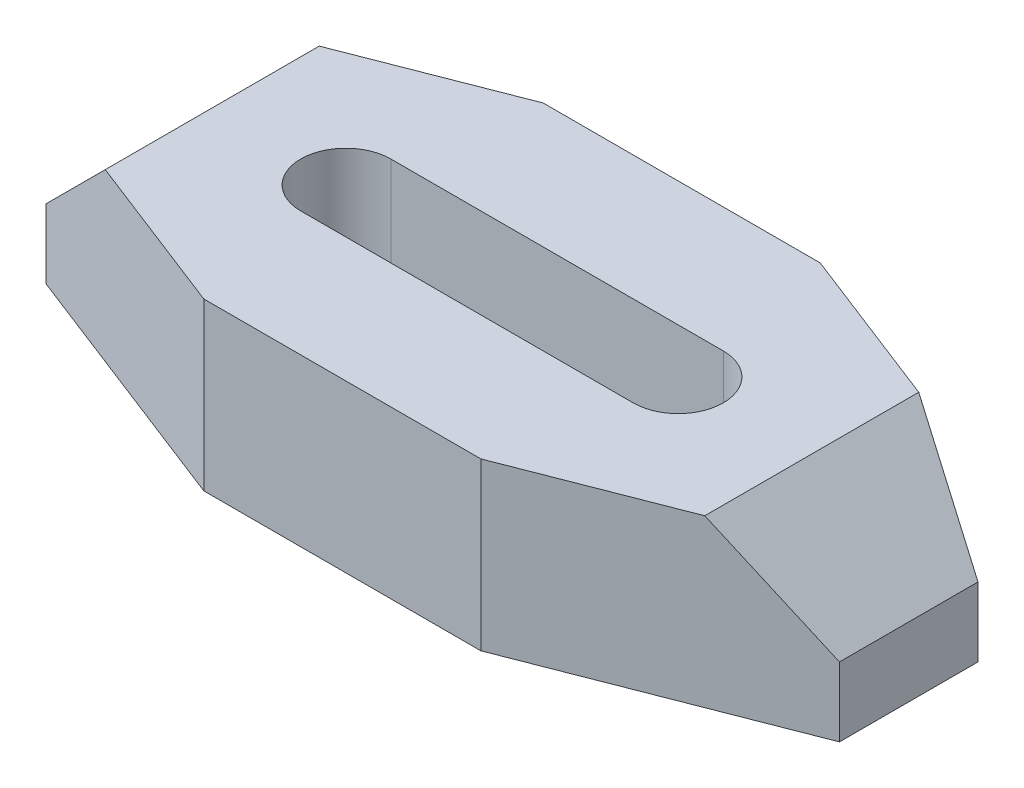
ISO-10303-21;
HEADER;
FILE_DESCRIPTION(('STEP AP214'),'2;1');
FILE_NAME('part.step','',(''),(''),'','','');
FILE_SCHEMA(('AUTOMOTIVE_DESIGN { 1 0 10303 214 1 1 1 1 }'));
ENDSEC;
DATA;
#1=APPLICATION_CONTEXT('core data for automotive mechanical design processes');
#2=APPLICATION_PROTOCOL_DEFINITION('international standard','automotive_design',2000,#1);
#3=PRODUCT_CONTEXT('',#1,'mechanical');
#4=PRODUCT('Part','Part','',(#3));
#5=PRODUCT_RELATED_PRODUCT_CATEGORY('part','',(#4));
#6=PRODUCT_DEFINITION_FORMATION('','',#4);
#7=PRODUCT_DEFINITION_CONTEXT('part definition',#1,'design');
#8=PRODUCT_DEFINITION('design','',#6,#7);
#9=PRODUCT_DEFINITION_SHAPE('','',#8);
#10=(LENGTH_UNIT() NAMED_UNIT(*) SI_UNIT(.MILLI.,.METRE.));
#11=(NAMED_UNIT(*) PLANE_ANGLE_UNIT() SI_UNIT($,.RADIAN.));
#12=(NAMED_UNIT(*) SI_UNIT($,.STERADIAN.) SOLID_ANGLE_UNIT());
#13=UNCERTAINTY_MEASURE_WITH_UNIT(LENGTH_MEASURE(1.E-05),#10,'distance_accuracy_value','');
#14=(GEOMETRIC_REPRESENTATION_CONTEXT(3) GLOBAL_UNCERTAINTY_ASSIGNED_CONTEXT((#13)) GLOBAL_UNIT_ASSIGNED_CONTEXT((#10,
#11,#12)) REPRESENTATION_CONTEXT('',''));
#15=CARTESIAN_POINT('',(0.,0.,0.));
#16=DIRECTION('',(0.,0.,1.));
#17=DIRECTION('',(1.,0.,0.));
#18=AXIS2_PLACEMENT_3D('',#15,#16,#17);
#19=CARTESIAN_POINT('',(0.,2.4,0.));
#20=DIRECTION('',(0.,1.,0.));
#21=DIRECTION('',(0.,0.,1.));
#22=AXIS2_PLACEMENT_3D('',#19,#20,#21);
#23=PLANE('',#22);
#24=DIRECTION('',(0.931983771317935,0.,-0.3625));
#25=VECTOR('',#24,1.);
#26=CARTESIAN_POINT('',(-0.604426001316983,2.4,1.58234276939121));
#27=LINE('',#26,#25);
#28=CARTESIAN_POINT('',(-0.604426001316983,2.4,1.58234276939121));
#29=VERTEX_POINT('',#28);
#30=CARTESIAN_POINT('',(1.72350908395476,2.4,0.676880148279621));
#31=VERTEX_POINT('',#30);
#32=EDGE_CURVE('E185',#29,#31,#27,.T.);
#33=ORIENTED_EDGE('',*,*,#32,.T.);
#34=DIRECTION('',(0.,0.,-1.));
#35=VECTOR('',#34,1.);
#36=CARTESIAN_POINT('',(1.72350908395475,2.4,-1.86765723060879));
#37=LINE('',#36,#35);
#38=CARTESIAN_POINT('',(1.72350908395476,2.4,-2.41219460949719));
#39=VERTEX_POINT('',#38);
#40=EDGE_CURVE('E239',#31,#39,#37,.T.);
#41=ORIENTED_EDGE('',*,*,#40,.T.);
#42=DIRECTION('',(-0.931983771317935,0.,-0.3625));
#43=VECTOR('',#42,1.);
#44=CARTESIAN_POINT('',(-0.604426001316983,2.4,-3.31765723060879));
#45=LINE('',#44,#43);
#46=CARTESIAN_POINT('',(-0.604426001316983,2.4,-3.31765723060879));
#47=VERTEX_POINT('',#46);
#48=EDGE_CURVE('E188',#39,#47,#45,.T.);
#49=ORIENTED_EDGE('',*,*,#48,.T.);
#50=DIRECTION('',(-1.,0.,0.));
#51=VECTOR('',#50,1.);
#52=CARTESIAN_POINT('',(-0.604426001316983,2.4,-3.31765723060879));
#53=LINE('',#52,#51);
#54=CARTESIAN_POINT('',(-4.60442600131698,2.4,-3.31765723060879));
#55=VERTEX_POINT('',#54);
#56=EDGE_CURVE('E190',#47,#55,#53,.T.);
#57=ORIENTED_EDGE('',*,*,#56,.T.);
#58=DIRECTION('',(-0.931983771317935,0.,0.3625));
#59=VECTOR('',#58,1.);
#60=CARTESIAN_POINT('',(-4.60442600131698,2.4,-3.31765723060879));
#61=LINE('',#60,#59);
#62=CARTESIAN_POINT('',(-6.93236108658872,2.4,-2.41219460949719));
#63=VERTEX_POINT('',#62);
#64=EDGE_CURVE('E177',#55,#63,#61,.T.);
#65=ORIENTED_EDGE('',*,*,#64,.T.);
#66=DIRECTION('',(0.,0.,1.));
#67=VECTOR('',#66,1.);
#68=CARTESIAN_POINT('',(-6.93236108658872,2.4,0.132342769391215));
#69=LINE('',#68,#67);
#70=CARTESIAN_POINT('',(-6.93236108658872,2.4,0.67688014827962));
#71=VERTEX_POINT('',#70);
#72=EDGE_CURVE('E230',#63,#71,#69,.T.);
#73=ORIENTED_EDGE('',*,*,#72,.T.);
#74=DIRECTION('',(0.931983771317935,0.,0.3625));
#75=VECTOR('',#74,1.);
#76=CARTESIAN_POINT('',(-4.60442600131698,2.4,1.58234276939121));
#77=LINE('',#76,#75);
#78=CARTESIAN_POINT('',(-4.60442600131698,2.4,1.58234276939121));
#79=VERTEX_POINT('',#78);
#80=EDGE_CURVE('E180',#71,#79,#77,.T.);
#81=ORIENTED_EDGE('',*,*,#80,.T.);
#82=DIRECTION('',(1.,0.,0.));
#83=VECTOR('',#82,1.);
#84=CARTESIAN_POINT('',(-0.604426001316983,2.4,1.58234276939121));
#85=LINE('',#84,#83);
#86=EDGE_CURVE('E183',#79,#29,#85,.T.);
#87=ORIENTED_EDGE('',*,*,#86,.T.);
#88=EDGE_LOOP('',(#33,#41,#49,#57,#65,#73,#81,#87));
#89=FACE_BOUND('',#88,.T.);
#90=DIRECTION('',(1.,0.,0.));
#91=VECTOR('',#90,1.);
#92=CARTESIAN_POINT('',(-0.204426001316984,2.4,-0.217657230608786));
#93=LINE('',#92,#91);
#94=CARTESIAN_POINT('',(-5.00442600131698,2.4,-0.217657230608786));
#95=VERTEX_POINT('',#94);
#96=CARTESIAN_POINT('',(-0.204426001316984,2.4,-0.217657230608786));
#97=VERTEX_POINT('',#96);
#98=EDGE_CURVE('E146',#95,#97,#93,.T.);
#99=ORIENTED_EDGE('',*,*,#98,.F.);
#100=CARTESIAN_POINT('',(-5.00442600131698,2.4,-0.867657230608785));
#101=DIRECTION('',(0.,1.,0.));
#102=DIRECTION('',(0.,0.,-1.));
#103=AXIS2_PLACEMENT_3D('',#100,#101,#102);
#104=CIRCLE('',#103,0.65);
#105=CARTESIAN_POINT('',(-5.00442600131698,2.4,-1.51765723060879));
#106=VERTEX_POINT('',#105);
#107=EDGE_CURVE('E136',#106,#95,#104,.T.);
#108=ORIENTED_EDGE('',*,*,#107,.F.);
#109=DIRECTION('',(-1.,0.,0.));
#110=VECTOR('',#109,1.);
#111=CARTESIAN_POINT('',(-0.204426001316984,2.4,-1.51765723060879));
#112=LINE('',#111,#110);
#113=CARTESIAN_POINT('',(-0.204426001316984,2.4,-1.51765723060879));
#114=VERTEX_POINT('',#113);
#115=EDGE_CURVE('E161',#114,#106,#112,.T.);
#116=ORIENTED_EDGE('',*,*,#115,.F.);
#117=CARTESIAN_POINT('',(-0.204426001316984,2.4,-0.867657230608785));
#118=DIRECTION('',(0.,1.,0.));
#119=DIRECTION('',(0.,0.,1.));
#120=AXIS2_PLACEMENT_3D('',#117,#118,#119);
#121=CIRCLE('',#120,0.65);
#122=EDGE_CURVE('E159',#97,#114,#121,.T.);
#123=ORIENTED_EDGE('',*,*,#122,.F.);
#124=EDGE_LOOP('',(#99,#108,#116,#123));
#125=FACE_BOUND('',#124,.T.);
#126=ADVANCED_FACE('F35',(#89,#125),#23,.T.);
#127=CARTESIAN_POINT('',(0.,0.,0.));
#128=DIRECTION('',(0.,1.,0.));
#129=DIRECTION('',(0.,0.,1.));
#130=AXIS2_PLACEMENT_3D('',#127,#128,#129);
#131=PLANE('',#130);
#132=DIRECTION('',(-0.931983771317935,0.,0.3625));
#133=VECTOR('',#132,1.);
#134=CARTESIAN_POINT('',(-4.60442600131698,0.,-3.31765723060879));
#135=LINE('',#134,#133);
#136=CARTESIAN_POINT('',(-4.60442600131698,0.,-3.31765723060879));
#137=VERTEX_POINT('',#136);
#138=CARTESIAN_POINT('',(-8.33236108658872,0.,-1.86765723060879));
#139=VERTEX_POINT('',#138);
#140=EDGE_CURVE('E154',#137,#139,#135,.T.);
#141=ORIENTED_EDGE('',*,*,#140,.F.);
#142=DIRECTION('',(-1.,0.,0.));
#143=VECTOR('',#142,1.);
#144=CARTESIAN_POINT('',(-0.604426001316983,0.,-3.31765723060879));
#145=LINE('',#144,#143);
#146=CARTESIAN_POINT('',(-0.604426001316983,0.,-3.31765723060879));
#147=VERTEX_POINT('',#146);
#148=EDGE_CURVE('E181',#147,#137,#145,.T.);
#149=ORIENTED_EDGE('',*,*,#148,.F.);
#150=DIRECTION('',(-0.931983771317935,0.,-0.3625));
#151=VECTOR('',#150,1.);
#152=CARTESIAN_POINT('',(-0.604426001316983,0.,-3.31765723060879));
#153=LINE('',#152,#151);
#154=CARTESIAN_POINT('',(3.12350908395475,0.,-1.86765723060879));
#155=VERTEX_POINT('',#154);
#156=EDGE_CURVE('E208',#155,#147,#153,.T.);
#157=ORIENTED_EDGE('',*,*,#156,.F.);
#158=DIRECTION('',(0.,0.,-1.));
#159=VECTOR('',#158,1.);
#160=CARTESIAN_POINT('',(3.12350908395475,0.,-1.86765723060879));
#161=LINE('',#160,#159);
#162=CARTESIAN_POINT('',(3.12350908395475,0.,0.132342769391215));
#163=VERTEX_POINT('',#162);
#164=EDGE_CURVE('E205',#163,#155,#161,.T.);
#165=ORIENTED_EDGE('',*,*,#164,.F.);
#166=DIRECTION('',(0.931983771317935,0.,-0.3625));
#167=VECTOR('',#166,1.);
#168=CARTESIAN_POINT('',(-0.604426001316983,0.,1.58234276939121));
#169=LINE('',#168,#167);
#170=CARTESIAN_POINT('',(-0.604426001316983,0.,1.58234276939121));
#171=VERTEX_POINT('',#170);
#172=EDGE_CURVE('E202',#171,#163,#169,.T.);
#173=ORIENTED_EDGE('',*,*,#172,.F.);
#174=DIRECTION('',(1.,0.,0.));
#175=VECTOR('',#174,1.);
#176=CARTESIAN_POINT('',(-0.604426001316983,0.,1.58234276939121));
#177=LINE('',#176,#175);
#178=CARTESIAN_POINT('',(-4.60442600131698,0.,1.58234276939121));
#179=VERTEX_POINT('',#178);
#180=EDGE_CURVE('E200',#179,#171,#177,.T.);
#181=ORIENTED_EDGE('',*,*,#180,.F.);
#182=DIRECTION('',(0.931983771317935,0.,0.3625));
#183=VECTOR('',#182,1.);
#184=CARTESIAN_POINT('',(-4.60442600131698,0.,1.58234276939121));
#185=LINE('',#184,#183);
#186=CARTESIAN_POINT('',(-8.33236108658872,0.,0.132342769391215));
#187=VERTEX_POINT('',#186);
#188=EDGE_CURVE('E198',#187,#179,#185,.T.);
#189=ORIENTED_EDGE('',*,*,#188,.F.);
#190=DIRECTION('',(0.,0.,1.));
#191=VECTOR('',#190,1.);
#192=CARTESIAN_POINT('',(-8.33236108658872,0.,-1.86765723060879));
#193=LINE('',#192,#191);
#194=EDGE_CURVE('E195',#139,#187,#193,.T.);
#195=ORIENTED_EDGE('',*,*,#194,.F.);
#196=EDGE_LOOP('',(#141,#149,#157,#165,#173,#181,#189,#195));
#197=FACE_BOUND('',#196,.T.);
#198=CARTESIAN_POINT('',(-5.00442600131698,0.,-0.867657230608785));
#199=DIRECTION('',(0.,1.,0.));
#200=DIRECTION('',(0.,0.,-1.));
#201=AXIS2_PLACEMENT_3D('',#198,#199,#200);
#202=CIRCLE('',#201,0.65);
#203=CARTESIAN_POINT('',(-5.00442600131698,0.,-1.51765723060879));
#204=VERTEX_POINT('',#203);
#205=CARTESIAN_POINT('',(-5.00442600131698,0.,-0.217657230608786));
#206=VERTEX_POINT('',#205);
#207=EDGE_CURVE('E165',#204,#206,#202,.T.);
#208=ORIENTED_EDGE('',*,*,#207,.T.);
#209=DIRECTION('',(1.,0.,0.));
#210=VECTOR('',#209,1.);
#211=CARTESIAN_POINT('',(-0.204426001316984,0.,-0.217657230608786));
#212=LINE('',#211,#210);
#213=CARTESIAN_POINT('',(-0.204426001316984,0.,-0.217657230608786));
#214=VERTEX_POINT('',#213);
#215=EDGE_CURVE('E153',#206,#214,#212,.T.);
#216=ORIENTED_EDGE('',*,*,#215,.T.);
#217=CARTESIAN_POINT('',(-0.204426001316984,0.,-0.867657230608785));
#218=DIRECTION('',(0.,1.,0.));
#219=DIRECTION('',(0.,0.,1.));
#220=AXIS2_PLACEMENT_3D('',#217,#218,#219);
#221=CIRCLE('',#220,0.65);
#222=CARTESIAN_POINT('',(-0.204426001316984,0.,-1.51765723060879));
#223=VERTEX_POINT('',#222);
#224=EDGE_CURVE('E168',#214,#223,#221,.T.);
#225=ORIENTED_EDGE('',*,*,#224,.T.);
#226=DIRECTION('',(-1.,0.,0.));
#227=VECTOR('',#226,1.);
#228=CARTESIAN_POINT('',(-0.204426001316984,0.,-1.51765723060879));
#229=LINE('',#228,#227);
#230=EDGE_CURVE('E147',#223,#204,#229,.T.);
#231=ORIENTED_EDGE('',*,*,#230,.T.);
#232=EDGE_LOOP('',(#208,#216,#225,#231));
#233=FACE_BOUND('',#232,.T.);
#234=ADVANCED_FACE('F275',(#197,#233),#131,.F.);
#235=CARTESIAN_POINT('',(-4.60442600131698,2.4,-3.31765723060879));
#236=DIRECTION('',(0.3625,0.,0.931983771317934));
#237=DIRECTION('',(0.931983771317935,0.,-0.3625));
#238=AXIS2_PLACEMENT_3D('',#235,#236,#237);
#239=PLANE('',#238);
#240=DIRECTION('',(0.,-1.,0.));
#241=VECTOR('',#240,1.);
#242=CARTESIAN_POINT('',(-8.33236108658872,2.4,-1.86765723060879));
#243=LINE('',#242,#241);
#244=CARTESIAN_POINT('',(-8.33236108658872,0.999999999999996,-1.86765723060879));
#245=VERTEX_POINT('',#244);
#246=EDGE_CURVE('E228',#245,#139,#243,.T.);
#247=ORIENTED_EDGE('',*,*,#246,.F.);
#248=DIRECTION('',(0.681790434938534,0.681790434938536,-0.265185983137583));
#249=VECTOR('',#248,1.);
#250=CARTESIAN_POINT('',(-7.36848892771288,1.96387215887584,-2.24256038702147));
#251=LINE('',#250,#249);
#252=EDGE_CURVE('E237',#245,#63,#251,.T.);
#253=ORIENTED_EDGE('',*,*,#252,.T.);
#254=ORIENTED_EDGE('',*,*,#64,.F.);
#255=DIRECTION('',(0.,-1.,0.));
#256=VECTOR('',#255,1.);
#257=CARTESIAN_POINT('',(-4.60442600131698,2.4,-3.31765723060879));
#258=LINE('',#257,#256);
#259=EDGE_CURVE('E192',#55,#137,#258,.T.);
#260=ORIENTED_EDGE('',*,*,#259,.T.);
#261=ORIENTED_EDGE('',*,*,#140,.T.);
#262=EDGE_LOOP('',(#247,#253,#254,#260,#261));
#263=FACE_BOUND('',#262,.T.);
#264=ADVANCED_FACE('F294',(#263),#239,.F.);
#265=CARTESIAN_POINT('',(-8.33236108658872,2.4,-1.86765723060879));
#266=DIRECTION('',(1.,0.,0.));
#267=DIRECTION('',(0.,0.,-1.));
#268=AXIS2_PLACEMENT_3D('',#265,#266,#267);
#269=PLANE('',#268);
#270=DIRECTION('',(0.,-1.,0.));
#271=VECTOR('',#270,1.);
#272=CARTESIAN_POINT('',(-8.33236108658872,2.4,0.132342769391215));
#273=LINE('',#272,#271);
#274=CARTESIAN_POINT('',(-8.33236108658872,0.999999999999996,0.132342769391215));
#275=VERTEX_POINT('',#274);
#276=EDGE_CURVE('E226',#275,#187,#273,.T.);
#277=ORIENTED_EDGE('',*,*,#276,.F.);
#278=DIRECTION('',(0.,0.,-1.));
#279=VECTOR('',#278,1.);
#280=CARTESIAN_POINT('',(-8.33236108658872,0.999999999999996,-1.86765723060879));
#281=LINE('',#280,#279);
#282=EDGE_CURVE('E235',#275,#245,#281,.T.);
#283=ORIENTED_EDGE('',*,*,#282,.T.);
#284=ORIENTED_EDGE('',*,*,#246,.T.);
#285=ORIENTED_EDGE('',*,*,#194,.T.);
#286=EDGE_LOOP('',(#277,#283,#284,#285));
#287=FACE_BOUND('',#286,.T.);
#288=ADVANCED_FACE('F268',(#287),#269,.F.);
#289=CARTESIAN_POINT('',(-4.60442600131698,2.4,1.58234276939121));
#290=DIRECTION('',(0.3625,0.,-0.931983771317934));
#291=DIRECTION('',(-0.931983771317935,0.,-0.3625));
#292=AXIS2_PLACEMENT_3D('',#289,#290,#291);
#293=PLANE('',#292);
#294=ORIENTED_EDGE('',*,*,#80,.F.);
#295=DIRECTION('',(-0.681790434938534,-0.681790434938536,-0.265185983137583));
#296=VECTOR('',#295,1.);
#297=CARTESIAN_POINT('',(-7.05474187485793,2.2776192117308,0.6292794956579));
#298=LINE('',#297,#296);
#299=EDGE_CURVE('E233',#71,#275,#298,.T.);
#300=ORIENTED_EDGE('',*,*,#299,.T.);
#301=ORIENTED_EDGE('',*,*,#276,.T.);
#302=ORIENTED_EDGE('',*,*,#188,.T.);
#303=DIRECTION('',(0.,-1.,0.));
#304=VECTOR('',#303,1.);
#305=CARTESIAN_POINT('',(-4.60442600131698,2.4,1.58234276939121));
#306=LINE('',#305,#304);
#307=EDGE_CURVE('E223',#79,#179,#306,.T.);
#308=ORIENTED_EDGE('',*,*,#307,.F.);
#309=EDGE_LOOP('',(#294,#300,#301,#302,#308));
#310=FACE_BOUND('',#309,.T.);
#311=ADVANCED_FACE('F265',(#310),#293,.F.);
#312=CARTESIAN_POINT('',(-0.604426001316983,2.4,1.58234276939121));
#313=DIRECTION('',(0.,0.,-1.));
#314=DIRECTION('',(-1.,0.,0.));
#315=AXIS2_PLACEMENT_3D('',#312,#313,#314);
#316=PLANE('',#315);
#317=ORIENTED_EDGE('',*,*,#180,.T.);
#318=DIRECTION('',(0.,-1.,0.));
#319=VECTOR('',#318,1.);
#320=CARTESIAN_POINT('',(-0.604426001316983,2.4,1.58234276939121));
#321=LINE('',#320,#319);
#322=EDGE_CURVE('E220',#29,#171,#321,.T.);
#323=ORIENTED_EDGE('',*,*,#322,.F.);
#324=ORIENTED_EDGE('',*,*,#86,.F.);
#325=ORIENTED_EDGE('',*,*,#307,.T.);
#326=EDGE_LOOP('',(#317,#323,#324,#325));
#327=FACE_BOUND('',#326,.T.);
#328=ADVANCED_FACE('F280',(#327),#316,.F.);
#329=CARTESIAN_POINT('',(-0.604426001316983,2.4,1.58234276939121));
#330=DIRECTION('',(-0.3625,0.,-0.931983771317934));
#331=DIRECTION('',(-0.931983771317935,0.,0.3625));
#332=AXIS2_PLACEMENT_3D('',#329,#330,#331);
#333=PLANE('',#332);
#334=DIRECTION('',(0.,-1.,0.));
#335=VECTOR('',#334,1.);
#336=CARTESIAN_POINT('',(3.12350908395475,2.4,0.132342769391215));
#337=LINE('',#336,#335);
#338=CARTESIAN_POINT('',(3.12350908395475,0.999999999999994,0.132342769391215));
#339=VERTEX_POINT('',#338);
#340=EDGE_CURVE('E218',#339,#163,#337,.T.);
#341=ORIENTED_EDGE('',*,*,#340,.F.);
#342=DIRECTION('',(-0.681790434938534,0.681790434938536,0.265185983137583));
#343=VECTOR('',#342,1.);
#344=CARTESIAN_POINT('',(1.84588987222396,2.2776192117308,0.6292794956579));
#345=LINE('',#344,#343);
#346=EDGE_CURVE('E11',#339,#31,#345,.T.);
#347=ORIENTED_EDGE('',*,*,#346,.T.);
#348=ORIENTED_EDGE('',*,*,#32,.F.);
#349=ORIENTED_EDGE('',*,*,#322,.T.);
#350=ORIENTED_EDGE('',*,*,#172,.T.);
#351=EDGE_LOOP('',(#341,#347,#348,#349,#350));
#352=FACE_BOUND('',#351,.T.);
#353=ADVANCED_FACE('F283',(#352),#333,.F.);
#354=CARTESIAN_POINT('',(3.12350908395475,2.4,-1.86765723060879));
#355=DIRECTION('',(-1.,0.,0.));
#356=DIRECTION('',(0.,0.,1.));
#357=AXIS2_PLACEMENT_3D('',#354,#355,#356);
#358=PLANE('',#357);
#359=DIRECTION('',(0.,-1.,0.));
#360=VECTOR('',#359,1.);
#361=CARTESIAN_POINT('',(3.12350908395475,2.4,-1.86765723060879));
#362=LINE('',#361,#360);
#363=CARTESIAN_POINT('',(3.12350908395475,0.999999999999994,-1.86765723060879));
#364=VERTEX_POINT('',#363);
#365=EDGE_CURVE('E216',#364,#155,#362,.T.);
#366=ORIENTED_EDGE('',*,*,#365,.F.);
#367=DIRECTION('',(0.,0.,1.));
#368=VECTOR('',#367,1.);
#369=CARTESIAN_POINT('',(3.12350908395475,0.999999999999994,0.132342769391215));
#370=LINE('',#369,#368);
#371=EDGE_CURVE('E44',#364,#339,#370,.T.);
#372=ORIENTED_EDGE('',*,*,#371,.T.);
#373=ORIENTED_EDGE('',*,*,#340,.T.);
#374=ORIENTED_EDGE('',*,*,#164,.T.);
#375=EDGE_LOOP('',(#366,#372,#373,#374));
#376=FACE_BOUND('',#375,.T.);
#377=ADVANCED_FACE('F303',(#376),#358,.F.);
#378=CARTESIAN_POINT('',(-0.604426001316983,2.4,-3.31765723060879));
#379=DIRECTION('',(-0.3625,0.,0.931983771317934));
#380=DIRECTION('',(0.931983771317935,0.,0.3625));
#381=AXIS2_PLACEMENT_3D('',#378,#379,#380);
#382=PLANE('',#381);
#383=ORIENTED_EDGE('',*,*,#48,.F.);
#384=DIRECTION('',(0.681790434938534,-0.681790434938536,0.265185983137583));
#385=VECTOR('',#384,1.);
#386=CARTESIAN_POINT('',(2.15963692507891,1.96387215887584,-2.24256038702147));
#387=LINE('',#386,#385);
#388=EDGE_CURVE('E58',#39,#364,#387,.T.);
#389=ORIENTED_EDGE('',*,*,#388,.T.);
#390=ORIENTED_EDGE('',*,*,#365,.T.);
#391=ORIENTED_EDGE('',*,*,#156,.T.);
#392=DIRECTION('',(0.,-1.,0.));
#393=VECTOR('',#392,1.);
#394=CARTESIAN_POINT('',(-0.604426001316983,2.4,-3.31765723060879));
#395=LINE('',#394,#393);
#396=EDGE_CURVE('E213',#47,#147,#395,.T.);
#397=ORIENTED_EDGE('',*,*,#396,.F.);
#398=EDGE_LOOP('',(#383,#389,#390,#391,#397));
#399=FACE_BOUND('',#398,.T.);
#400=ADVANCED_FACE('F248',(#399),#382,.F.);
#401=CARTESIAN_POINT('',(-0.604426001316983,2.4,-3.31765723060879));
#402=DIRECTION('',(0.,0.,1.));
#403=DIRECTION('',(1.,0.,0.));
#404=AXIS2_PLACEMENT_3D('',#401,#402,#403);
#405=PLANE('',#404);
#406=ORIENTED_EDGE('',*,*,#148,.T.);
#407=ORIENTED_EDGE('',*,*,#259,.F.);
#408=ORIENTED_EDGE('',*,*,#56,.F.);
#409=ORIENTED_EDGE('',*,*,#396,.T.);
#410=EDGE_LOOP('',(#406,#407,#408,#409));
#411=FACE_BOUND('',#410,.T.);
#412=ADVANCED_FACE('F254',(#411),#405,.F.);
#413=CARTESIAN_POINT('',(-5.00442600131698,2.4,-0.867657230608785));
#414=DIRECTION('',(0.,-1.,0.));
#415=DIRECTION('',(0.,0.,-1.));
#416=AXIS2_PLACEMENT_3D('',#413,#414,#415);
#417=CYLINDRICAL_SURFACE('',#416,0.65);
#418=ORIENTED_EDGE('',*,*,#207,.F.);
#419=DIRECTION('',(0.,-1.,0.));
#420=VECTOR('',#419,1.);
#421=CARTESIAN_POINT('',(-5.00442600131698,2.4,-1.51765723060879));
#422=LINE('',#421,#420);
#423=EDGE_CURVE('E142',#106,#204,#422,.T.);
#424=ORIENTED_EDGE('',*,*,#423,.F.);
#425=ORIENTED_EDGE('',*,*,#107,.T.);
#426=DIRECTION('',(0.,-1.,0.));
#427=VECTOR('',#426,1.);
#428=CARTESIAN_POINT('',(-5.00442600131698,2.4,-0.217657230608786));
#429=LINE('',#428,#427);
#430=EDGE_CURVE('E139',#95,#206,#429,.T.);
#431=ORIENTED_EDGE('',*,*,#430,.T.);
#432=EDGE_LOOP('',(#418,#424,#425,#431));
#433=FACE_BOUND('',#432,.T.);
#434=ADVANCED_FACE('F138',(#433),#417,.F.);
#435=CARTESIAN_POINT('',(-0.204426001316984,2.4,-0.217657230608786));
#436=DIRECTION('',(0.,0.,-1.));
#437=DIRECTION('',(-1.,0.,0.));
#438=AXIS2_PLACEMENT_3D('',#435,#436,#437);
#439=PLANE('',#438);
#440=ORIENTED_EDGE('',*,*,#215,.F.);
#441=ORIENTED_EDGE('',*,*,#430,.F.);
#442=ORIENTED_EDGE('',*,*,#98,.T.);
#443=DIRECTION('',(0.,-1.,0.));
#444=VECTOR('',#443,1.);
#445=CARTESIAN_POINT('',(-0.204426001316984,2.4,-0.217657230608786));
#446=LINE('',#445,#444);
#447=EDGE_CURVE('E155',#97,#214,#446,.T.);
#448=ORIENTED_EDGE('',*,*,#447,.T.);
#449=EDGE_LOOP('',(#440,#441,#442,#448));
#450=FACE_BOUND('',#449,.T.);
#451=ADVANCED_FACE('F150',(#450),#439,.T.);
#452=CARTESIAN_POINT('',(-0.204426001316984,2.4,-0.867657230608785));
#453=DIRECTION('',(0.,-1.,0.));
#454=DIRECTION('',(0.,0.,-1.));
#455=AXIS2_PLACEMENT_3D('',#452,#453,#454);
#456=CYLINDRICAL_SURFACE('',#455,0.65);
#457=ORIENTED_EDGE('',*,*,#224,.F.);
#458=ORIENTED_EDGE('',*,*,#447,.F.);
#459=ORIENTED_EDGE('',*,*,#122,.T.);
#460=DIRECTION('',(0.,-1.,0.));
#461=VECTOR('',#460,1.);
#462=CARTESIAN_POINT('',(-0.204426001316984,2.4,-1.51765723060879));
#463=LINE('',#462,#461);
#464=EDGE_CURVE('E174',#114,#223,#463,.T.);
#465=ORIENTED_EDGE('',*,*,#464,.T.);
#466=EDGE_LOOP('',(#457,#458,#459,#465));
#467=FACE_BOUND('',#466,.T.);
#468=ADVANCED_FACE('F366',(#467),#456,.F.);
#469=CARTESIAN_POINT('',(-0.204426001316984,2.4,-1.51765723060879));
#470=DIRECTION('',(0.,0.,1.));
#471=DIRECTION('',(1.,0.,0.));
#472=AXIS2_PLACEMENT_3D('',#469,#470,#471);
#473=PLANE('',#472);
#474=ORIENTED_EDGE('',*,*,#230,.F.);
#475=ORIENTED_EDGE('',*,*,#464,.F.);
#476=ORIENTED_EDGE('',*,*,#115,.T.);
#477=ORIENTED_EDGE('',*,*,#423,.T.);
#478=EDGE_LOOP('',(#474,#475,#476,#477));
#479=FACE_BOUND('',#478,.T.);
#480=ADVANCED_FACE('F288',(#479),#473,.T.);
#481=CARTESIAN_POINT('',(-6.93236108658872,2.4,0.));
#482=DIRECTION('',(-0.707106781186549,0.707106781186546,0.));
#483=DIRECTION('',(0.,0.,-1.));
#484=AXIS2_PLACEMENT_3D('',#481,#482,#483);
#485=PLANE('',#484);
#486=ORIENTED_EDGE('',*,*,#252,.F.);
#487=ORIENTED_EDGE('',*,*,#282,.F.);
#488=ORIENTED_EDGE('',*,*,#299,.F.);
#489=ORIENTED_EDGE('',*,*,#72,.F.);
#490=EDGE_LOOP('',(#486,#487,#488,#489));
#491=FACE_BOUND('',#490,.T.);
#492=ADVANCED_FACE('F261',(#491),#485,.T.);
#493=CARTESIAN_POINT('',(1.72350908395475,2.4,0.));
#494=DIRECTION('',(0.707106781186549,0.707106781186546,0.));
#495=DIRECTION('',(0.,0.,1.));
#496=AXIS2_PLACEMENT_3D('',#493,#494,#495);
#497=PLANE('',#496);
#498=ORIENTED_EDGE('',*,*,#346,.F.);
#499=ORIENTED_EDGE('',*,*,#371,.F.);
#500=ORIENTED_EDGE('',*,*,#388,.F.);
#501=ORIENTED_EDGE('',*,*,#40,.F.);
#502=EDGE_LOOP('',(#498,#499,#500,#501));
#503=FACE_BOUND('',#502,.T.);
#504=ADVANCED_FACE('F38',(#503),#497,.T.);
#505=CLOSED_SHELL('',(#126,#234,#264,#288,#311,#328,#353,#377,#400,#412,#434,#451,#468,#480,
#492,#504));
#506=MANIFOLD_SOLID_BREP('B2',#505);
#507=ADVANCED_BREP_SHAPE_REPRESENTATION('',(#18,#506),#14);
#508=SHAPE_DEFINITION_REPRESENTATION(#9,#507);
ENDSEC;
END-ISO-10303-21;
